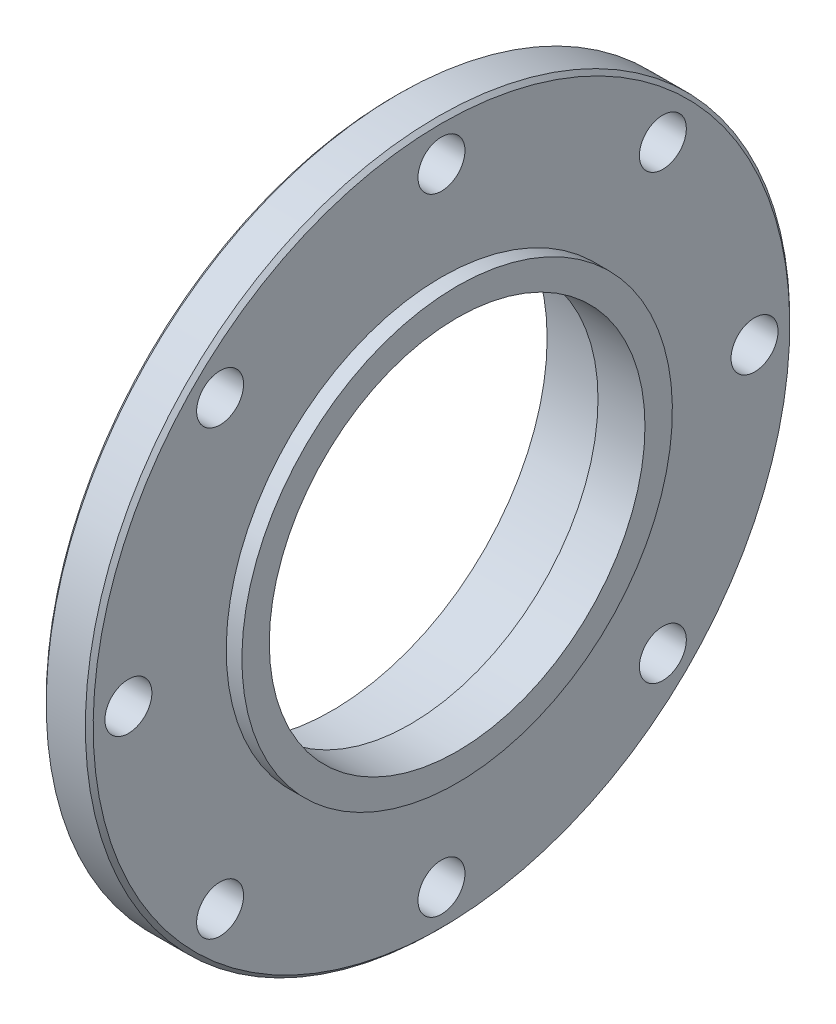
ISO-10303-21;
HEADER;
FILE_DESCRIPTION(('STEP AP214'),'2;1');
FILE_NAME('part.step','',(''),(''),'','','');
FILE_SCHEMA(('AUTOMOTIVE_DESIGN { 1 0 10303 214 1 1 1 1 }'));
ENDSEC;
DATA;
#1=APPLICATION_CONTEXT('core data for automotive mechanical design processes');
#2=APPLICATION_PROTOCOL_DEFINITION('international standard','automotive_design',2000,#1);
#3=PRODUCT_CONTEXT('',#1,'mechanical');
#4=PRODUCT('Part','Part','',(#3));
#5=PRODUCT_RELATED_PRODUCT_CATEGORY('part','',(#4));
#6=PRODUCT_DEFINITION_FORMATION('','',#4);
#7=PRODUCT_DEFINITION_CONTEXT('part definition',#1,'design');
#8=PRODUCT_DEFINITION('design','',#6,#7);
#9=PRODUCT_DEFINITION_SHAPE('','',#8);
#10=(LENGTH_UNIT() NAMED_UNIT(*) SI_UNIT(.MILLI.,.METRE.));
#11=(NAMED_UNIT(*) PLANE_ANGLE_UNIT() SI_UNIT($,.RADIAN.));
#12=(NAMED_UNIT(*) SI_UNIT($,.STERADIAN.) SOLID_ANGLE_UNIT());
#13=UNCERTAINTY_MEASURE_WITH_UNIT(LENGTH_MEASURE(1.E-05),#10,'distance_accuracy_value','');
#14=(GEOMETRIC_REPRESENTATION_CONTEXT(3) GLOBAL_UNCERTAINTY_ASSIGNED_CONTEXT((#13)) GLOBAL_UNIT_ASSIGNED_CONTEXT((#10,
#11,#12)) REPRESENTATION_CONTEXT('',''));
#15=CARTESIAN_POINT('',(0.,0.,0.));
#16=DIRECTION('',(0.,0.,1.));
#17=DIRECTION('',(1.,0.,0.));
#18=AXIS2_PLACEMENT_3D('',#15,#16,#17);
#19=CARTESIAN_POINT('',(0.,0.,0.));
#20=DIRECTION('',(-1.,0.,0.));
#21=DIRECTION('',(0.,-1.,0.));
#22=AXIS2_PLACEMENT_3D('',#19,#20,#21);
#23=PLANE('',#22);
#24=CARTESIAN_POINT('',(0.,0.,0.));
#25=DIRECTION('',(-1.,0.,0.));
#26=DIRECTION('',(0.,-1.,0.));
#27=AXIS2_PLACEMENT_3D('',#24,#25,#26);
#28=CIRCLE('',#27,29.5);
#29=CARTESIAN_POINT('',(0.,-29.5,0.));
#30=VERTEX_POINT('',#29);
#31=EDGE_CURVE('E68',#30,#30,#28,.T.);
#32=ORIENTED_EDGE('',*,*,#31,.T.);
#33=EDGE_LOOP('',(#32));
#34=FACE_BOUND('',#33,.T.);
#35=CARTESIAN_POINT('',(0.,0.,0.));
#36=DIRECTION('',(1.,0.,0.));
#37=DIRECTION('',(0.,0.,-1.));
#38=AXIS2_PLACEMENT_3D('',#35,#36,#37);
#39=CIRCLE('',#38,27.5);
#40=CARTESIAN_POINT('',(0.,0.,-27.5));
#41=VERTEX_POINT('',#40);
#42=EDGE_CURVE('E106',#41,#41,#39,.T.);
#43=ORIENTED_EDGE('',*,*,#42,.T.);
#44=EDGE_LOOP('',(#43));
#45=FACE_BOUND('',#44,.T.);
#46=ADVANCED_FACE('F42',(#34,#45),#23,.T.);
#47=CARTESIAN_POINT('',(16.,0.,0.));
#48=DIRECTION('',(1.,0.,0.));
#49=DIRECTION('',(0.,1.,0.));
#50=AXIS2_PLACEMENT_3D('',#47,#48,#49);
#51=CYLINDRICAL_SURFACE('',#50,30.);
#52=CARTESIAN_POINT('',(3.,0.,0.));
#53=DIRECTION('',(-1.,0.,0.));
#54=DIRECTION('',(0.,-1.,0.));
#55=AXIS2_PLACEMENT_3D('',#52,#53,#54);
#56=CIRCLE('',#55,30.);
#57=CARTESIAN_POINT('',(2.99999999999999,-30.,0.));
#58=VERTEX_POINT('',#57);
#59=EDGE_CURVE('E10',#58,#58,#56,.T.);
#60=ORIENTED_EDGE('',*,*,#59,.T.);
#61=EDGE_LOOP('',(#60));
#62=FACE_BOUND('',#61,.T.);
#63=CARTESIAN_POINT('',(0.499999999999957,0.,0.));
#64=DIRECTION('',(-1.,0.,0.));
#65=DIRECTION('',(0.,-1.,0.));
#66=AXIS2_PLACEMENT_3D('',#63,#64,#65);
#67=CIRCLE('',#66,30.);
#68=CARTESIAN_POINT('',(0.499999999999954,-30.,0.));
#69=VERTEX_POINT('',#68);
#70=EDGE_CURVE('E71',#69,#69,#67,.F.);
#71=ORIENTED_EDGE('',*,*,#70,.T.);
#72=EDGE_LOOP('',(#71));
#73=FACE_BOUND('',#72,.T.);
#74=ADVANCED_FACE('F147',(#62,#73),#51,.T.);
#75=CARTESIAN_POINT('',(8.,30.,0.));
#76=DIRECTION('',(-1.,0.,0.));
#77=DIRECTION('',(0.,-1.,0.));
#78=AXIS2_PLACEMENT_3D('',#75,#76,#77);
#79=PLANE('',#78);
#80=CARTESIAN_POINT('',(8.,0.,0.));
#81=DIRECTION('',(-1.,0.,0.));
#82=DIRECTION('',(0.,-1.,0.));
#83=AXIS2_PLACEMENT_3D('',#80,#81,#82);
#84=CIRCLE('',#83,35.);
#85=CARTESIAN_POINT('',(7.99999999999999,-35.,0.));
#86=VERTEX_POINT('',#85);
#87=EDGE_CURVE('E49',#86,#86,#84,.F.);
#88=ORIENTED_EDGE('',*,*,#87,.T.);
#89=EDGE_LOOP('',(#88));
#90=FACE_BOUND('',#89,.T.);
#91=CARTESIAN_POINT('',(8.,0.,0.));
#92=DIRECTION('',(-1.,0.,0.));
#93=DIRECTION('',(0.,-1.,0.));
#94=AXIS2_PLACEMENT_3D('',#91,#92,#93);
#95=CIRCLE('',#94,44.5);
#96=CARTESIAN_POINT('',(7.99999999999999,-44.5,0.));
#97=VERTEX_POINT('',#96);
#98=EDGE_CURVE('E57',#97,#97,#95,.T.);
#99=ORIENTED_EDGE('',*,*,#98,.T.);
#100=EDGE_LOOP('',(#99));
#101=FACE_BOUND('',#100,.T.);
#102=CARTESIAN_POINT('',(8.,40.,0.));
#103=DIRECTION('',(-1.,0.,0.));
#104=DIRECTION('',(0.,-1.,0.));
#105=AXIS2_PLACEMENT_3D('',#102,#103,#104);
#106=CIRCLE('',#105,3.);
#107=CARTESIAN_POINT('',(8.,37.,0.));
#108=VERTEX_POINT('',#107);
#109=EDGE_CURVE('E100',#108,#108,#106,.T.);
#110=ORIENTED_EDGE('',*,*,#109,.F.);
#111=EDGE_LOOP('',(#110));
#112=FACE_BOUND('',#111,.T.);
#113=CARTESIAN_POINT('',(8.,28.2842712474619,28.2842712474619));
#114=DIRECTION('',(-1.,0.,0.));
#115=DIRECTION('',(0.,-1.,0.));
#116=AXIS2_PLACEMENT_3D('',#113,#114,#115);
#117=CIRCLE('',#116,3.00000000000007);
#118=CARTESIAN_POINT('',(8.,25.2842712474618,28.2842712474619));
#119=VERTEX_POINT('',#118);
#120=EDGE_CURVE('E135',#119,#119,#117,.T.);
#121=ORIENTED_EDGE('',*,*,#120,.F.);
#122=EDGE_LOOP('',(#121));
#123=FACE_BOUND('',#122,.T.);
#124=CARTESIAN_POINT('',(8.,0.,40.));
#125=DIRECTION('',(-1.,0.,0.));
#126=DIRECTION('',(0.,-1.,0.));
#127=AXIS2_PLACEMENT_3D('',#124,#125,#126);
#128=CIRCLE('',#127,3.00000000000014);
#129=CARTESIAN_POINT('',(8.,-3.00000000000014,40.));
#130=VERTEX_POINT('',#129);
#131=EDGE_CURVE('E132',#130,#130,#128,.T.);
#132=ORIENTED_EDGE('',*,*,#131,.F.);
#133=EDGE_LOOP('',(#132));
#134=FACE_BOUND('',#133,.T.);
#135=CARTESIAN_POINT('',(7.99999999999999,-28.2842712474619,28.2842712474619));
#136=DIRECTION('',(-1.,0.,0.));
#137=DIRECTION('',(0.,-1.,0.));
#138=AXIS2_PLACEMENT_3D('',#135,#136,#137);
#139=CIRCLE('',#138,3.0000000000002);
#140=CARTESIAN_POINT('',(7.99999999999999,-31.2842712474621,28.2842712474619));
#141=VERTEX_POINT('',#140);
#142=EDGE_CURVE('E129',#141,#141,#139,.T.);
#143=ORIENTED_EDGE('',*,*,#142,.F.);
#144=EDGE_LOOP('',(#143));
#145=FACE_BOUND('',#144,.T.);
#146=CARTESIAN_POINT('',(7.99999999999999,-40.,0.));
#147=DIRECTION('',(-1.,0.,0.));
#148=DIRECTION('',(0.,-1.,0.));
#149=AXIS2_PLACEMENT_3D('',#146,#147,#148);
#150=CIRCLE('',#149,3.00000000000027);
#151=CARTESIAN_POINT('',(7.99999999999999,-43.0000000000003,0.));
#152=VERTEX_POINT('',#151);
#153=EDGE_CURVE('E126',#152,#152,#150,.T.);
#154=ORIENTED_EDGE('',*,*,#153,.F.);
#155=EDGE_LOOP('',(#154));
#156=FACE_BOUND('',#155,.T.);
#157=CARTESIAN_POINT('',(7.99999999999999,-28.2842712474619,-28.2842712474619));
#158=DIRECTION('',(-1.,0.,0.));
#159=DIRECTION('',(0.,-1.,0.));
#160=AXIS2_PLACEMENT_3D('',#157,#158,#159);
#161=CIRCLE('',#160,3.00000000000034);
#162=CARTESIAN_POINT('',(7.99999999999999,-31.2842712474622,-28.2842712474619));
#163=VERTEX_POINT('',#162);
#164=EDGE_CURVE('E123',#163,#163,#161,.T.);
#165=ORIENTED_EDGE('',*,*,#164,.F.);
#166=EDGE_LOOP('',(#165));
#167=FACE_BOUND('',#166,.T.);
#168=CARTESIAN_POINT('',(8.,0.,-40.));
#169=DIRECTION('',(-1.,0.,0.));
#170=DIRECTION('',(0.,-1.,0.));
#171=AXIS2_PLACEMENT_3D('',#168,#169,#170);
#172=CIRCLE('',#171,3.00000000000041);
#173=CARTESIAN_POINT('',(8.,-3.00000000000042,-40.));
#174=VERTEX_POINT('',#173);
#175=EDGE_CURVE('E120',#174,#174,#172,.T.);
#176=ORIENTED_EDGE('',*,*,#175,.F.);
#177=EDGE_LOOP('',(#176));
#178=FACE_BOUND('',#177,.T.);
#179=CARTESIAN_POINT('',(8.,28.2842712474619,-28.2842712474619));
#180=DIRECTION('',(-1.,0.,0.));
#181=DIRECTION('',(0.,-1.,0.));
#182=AXIS2_PLACEMENT_3D('',#179,#180,#181);
#183=CIRCLE('',#182,3.00000000000048);
#184=CARTESIAN_POINT('',(8.,25.2842712474614,-28.2842712474619));
#185=VERTEX_POINT('',#184);
#186=EDGE_CURVE('E117',#185,#185,#183,.T.);
#187=ORIENTED_EDGE('',*,*,#186,.F.);
#188=EDGE_LOOP('',(#187));
#189=FACE_BOUND('',#188,.T.);
#190=ADVANCED_FACE('F143',(#90,#101,#112,#123,#134,#145,#156,#167,#178,#189),#79,.T.);
#191=CARTESIAN_POINT('',(16.,0.,0.));
#192=DIRECTION('',(1.,0.,0.));
#193=DIRECTION('',(0.,1.,0.));
#194=AXIS2_PLACEMENT_3D('',#191,#192,#193);
#195=CYLINDRICAL_SURFACE('',#194,45.);
#196=CARTESIAN_POINT('',(8.5,0.,0.));
#197=DIRECTION('',(-1.,0.,0.));
#198=DIRECTION('',(0.,-1.,0.));
#199=AXIS2_PLACEMENT_3D('',#196,#197,#198);
#200=CIRCLE('',#199,45.);
#201=CARTESIAN_POINT('',(8.5,-45.,0.));
#202=VERTEX_POINT('',#201);
#203=EDGE_CURVE('E62',#202,#202,#200,.F.);
#204=ORIENTED_EDGE('',*,*,#203,.T.);
#205=EDGE_LOOP('',(#204));
#206=FACE_BOUND('',#205,.T.);
#207=CARTESIAN_POINT('',(13.5,0.,0.));
#208=DIRECTION('',(1.,0.,0.));
#209=DIRECTION('',(0.,1.,0.));
#210=AXIS2_PLACEMENT_3D('',#207,#208,#209);
#211=CIRCLE('',#210,45.);
#212=CARTESIAN_POINT('',(13.5,45.,0.));
#213=VERTEX_POINT('',#212);
#214=EDGE_CURVE('E65',#213,#213,#211,.F.);
#215=ORIENTED_EDGE('',*,*,#214,.T.);
#216=EDGE_LOOP('',(#215));
#217=FACE_BOUND('',#216,.T.);
#218=ADVANCED_FACE('F146',(#206,#217),#195,.T.);
#219=CARTESIAN_POINT('',(14.,45.,0.));
#220=DIRECTION('',(1.,0.,0.));
#221=DIRECTION('',(0.,1.,0.));
#222=AXIS2_PLACEMENT_3D('',#219,#220,#221);
#223=PLANE('',#222);
#224=CARTESIAN_POINT('',(14.,0.,0.));
#225=DIRECTION('',(1.,0.,0.));
#226=DIRECTION('',(0.,1.,0.));
#227=AXIS2_PLACEMENT_3D('',#224,#225,#226);
#228=CIRCLE('',#227,44.5);
#229=CARTESIAN_POINT('',(14.,44.5,0.));
#230=VERTEX_POINT('',#229);
#231=EDGE_CURVE('E53',#230,#230,#228,.T.);
#232=ORIENTED_EDGE('',*,*,#231,.T.);
#233=EDGE_LOOP('',(#232));
#234=FACE_BOUND('',#233,.T.);
#235=CARTESIAN_POINT('',(14.,40.,0.));
#236=DIRECTION('',(1.,0.,0.));
#237=DIRECTION('',(0.,1.,0.));
#238=AXIS2_PLACEMENT_3D('',#235,#236,#237);
#239=CIRCLE('',#238,3.);
#240=CARTESIAN_POINT('',(14.,43.,0.));
#241=VERTEX_POINT('',#240);
#242=EDGE_CURVE('E75',#241,#241,#239,.T.);
#243=ORIENTED_EDGE('',*,*,#242,.F.);
#244=EDGE_LOOP('',(#243));
#245=FACE_BOUND('',#244,.T.);
#246=CARTESIAN_POINT('',(14.,28.2842712474619,28.2842712474619));
#247=DIRECTION('',(1.,0.,0.));
#248=DIRECTION('',(0.,1.,0.));
#249=AXIS2_PLACEMENT_3D('',#246,#247,#248);
#250=CIRCLE('',#249,3.00000000000007);
#251=CARTESIAN_POINT('',(14.,31.284271247462,28.2842712474619));
#252=VERTEX_POINT('',#251);
#253=EDGE_CURVE('E79',#252,#252,#250,.T.);
#254=ORIENTED_EDGE('',*,*,#253,.F.);
#255=EDGE_LOOP('',(#254));
#256=FACE_BOUND('',#255,.T.);
#257=CARTESIAN_POINT('',(14.,0.,40.));
#258=DIRECTION('',(1.,0.,0.));
#259=DIRECTION('',(0.,1.,0.));
#260=AXIS2_PLACEMENT_3D('',#257,#258,#259);
#261=CIRCLE('',#260,3.00000000000014);
#262=CARTESIAN_POINT('',(14.,3.00000000000014,40.));
#263=VERTEX_POINT('',#262);
#264=EDGE_CURVE('E82',#263,#263,#261,.T.);
#265=ORIENTED_EDGE('',*,*,#264,.F.);
#266=EDGE_LOOP('',(#265));
#267=FACE_BOUND('',#266,.T.);
#268=CARTESIAN_POINT('',(14.,-28.2842712474619,28.2842712474619));
#269=DIRECTION('',(1.,0.,0.));
#270=DIRECTION('',(0.,1.,0.));
#271=AXIS2_PLACEMENT_3D('',#268,#269,#270);
#272=CIRCLE('',#271,3.0000000000002);
#273=CARTESIAN_POINT('',(14.,-25.2842712474617,28.2842712474619));
#274=VERTEX_POINT('',#273);
#275=EDGE_CURVE('E85',#274,#274,#272,.T.);
#276=ORIENTED_EDGE('',*,*,#275,.F.);
#277=EDGE_LOOP('',(#276));
#278=FACE_BOUND('',#277,.T.);
#279=CARTESIAN_POINT('',(14.,-40.,0.));
#280=DIRECTION('',(1.,0.,0.));
#281=DIRECTION('',(0.,1.,0.));
#282=AXIS2_PLACEMENT_3D('',#279,#280,#281);
#283=CIRCLE('',#282,3.00000000000027);
#284=CARTESIAN_POINT('',(14.,-36.9999999999997,0.));
#285=VERTEX_POINT('',#284);
#286=EDGE_CURVE('E88',#285,#285,#283,.T.);
#287=ORIENTED_EDGE('',*,*,#286,.F.);
#288=EDGE_LOOP('',(#287));
#289=FACE_BOUND('',#288,.T.);
#290=CARTESIAN_POINT('',(14.,-28.2842712474619,-28.2842712474619));
#291=DIRECTION('',(1.,0.,0.));
#292=DIRECTION('',(0.,1.,0.));
#293=AXIS2_PLACEMENT_3D('',#290,#291,#292);
#294=CIRCLE('',#293,3.00000000000034);
#295=CARTESIAN_POINT('',(14.,-25.2842712474616,-28.2842712474619));
#296=VERTEX_POINT('',#295);
#297=EDGE_CURVE('E91',#296,#296,#294,.T.);
#298=ORIENTED_EDGE('',*,*,#297,.F.);
#299=EDGE_LOOP('',(#298));
#300=FACE_BOUND('',#299,.T.);
#301=CARTESIAN_POINT('',(14.,0.,-40.));
#302=DIRECTION('',(1.,0.,0.));
#303=DIRECTION('',(0.,1.,0.));
#304=AXIS2_PLACEMENT_3D('',#301,#302,#303);
#305=CIRCLE('',#304,3.00000000000041);
#306=CARTESIAN_POINT('',(14.,3.0000000000004,-40.));
#307=VERTEX_POINT('',#306);
#308=EDGE_CURVE('E94',#307,#307,#305,.T.);
#309=ORIENTED_EDGE('',*,*,#308,.F.);
#310=EDGE_LOOP('',(#309));
#311=FACE_BOUND('',#310,.T.);
#312=CARTESIAN_POINT('',(14.,28.2842712474619,-28.2842712474619));
#313=DIRECTION('',(1.,0.,0.));
#314=DIRECTION('',(0.,1.,0.));
#315=AXIS2_PLACEMENT_3D('',#312,#313,#314);
#316=CIRCLE('',#315,3.00000000000048);
#317=CARTESIAN_POINT('',(14.,31.2842712474624,-28.2842712474619));
#318=VERTEX_POINT('',#317);
#319=EDGE_CURVE('E97',#318,#318,#316,.T.);
#320=ORIENTED_EDGE('',*,*,#319,.F.);
#321=EDGE_LOOP('',(#320));
#322=FACE_BOUND('',#321,.T.);
#323=CARTESIAN_POINT('',(14.,0.,0.));
#324=DIRECTION('',(1.,0.,0.));
#325=DIRECTION('',(0.,1.,0.));
#326=AXIS2_PLACEMENT_3D('',#323,#324,#325);
#327=CIRCLE('',#326,27.5);
#328=CARTESIAN_POINT('',(14.,27.5,0.));
#329=VERTEX_POINT('',#328);
#330=EDGE_CURVE('E74',#329,#329,#327,.T.);
#331=ORIENTED_EDGE('',*,*,#330,.F.);
#332=EDGE_LOOP('',(#331));
#333=FACE_BOUND('',#332,.T.);
#334=ADVANCED_FACE('F215',(#234,#245,#256,#267,#278,#289,#300,#311,#322,#333),#223,.T.);
#335=CARTESIAN_POINT('',(16.,0.,0.));
#336=DIRECTION('',(1.,0.,0.));
#337=DIRECTION('',(0.,1.,0.));
#338=AXIS2_PLACEMENT_3D('',#335,#336,#337);
#339=CYLINDRICAL_SURFACE('',#338,27.5);
#340=ORIENTED_EDGE('',*,*,#330,.T.);
#341=EDGE_LOOP('',(#340));
#342=FACE_BOUND('',#341,.T.);
#343=CARTESIAN_POINT('',(16.,0.,0.));
#344=DIRECTION('',(1.,0.,0.));
#345=DIRECTION('',(0.,1.,0.));
#346=AXIS2_PLACEMENT_3D('',#343,#344,#345);
#347=CIRCLE('',#346,27.5);
#348=CARTESIAN_POINT('',(16.,27.5,0.));
#349=VERTEX_POINT('',#348);
#350=EDGE_CURVE('E103',#349,#349,#347,.T.);
#351=ORIENTED_EDGE('',*,*,#350,.F.);
#352=EDGE_LOOP('',(#351));
#353=FACE_BOUND('',#352,.T.);
#354=ADVANCED_FACE('F218',(#342,#353),#339,.T.);
#355=CARTESIAN_POINT('',(16.,27.5,0.));
#356=DIRECTION('',(1.,0.,0.));
#357=DIRECTION('',(0.,1.,0.));
#358=AXIS2_PLACEMENT_3D('',#355,#356,#357);
#359=PLANE('',#358);
#360=CARTESIAN_POINT('',(16.,0.,0.));
#361=DIRECTION('',(1.,0.,0.));
#362=DIRECTION('',(0.,0.,-1.));
#363=AXIS2_PLACEMENT_3D('',#360,#361,#362);
#364=CIRCLE('',#363,24.);
#365=CARTESIAN_POINT('',(16.,0.,-24.));
#366=VERTEX_POINT('',#365);
#367=EDGE_CURVE('E78',#366,#366,#364,.T.);
#368=ORIENTED_EDGE('',*,*,#367,.F.);
#369=EDGE_LOOP('',(#368));
#370=FACE_BOUND('',#369,.T.);
#371=ORIENTED_EDGE('',*,*,#350,.T.);
#372=EDGE_LOOP('',(#371));
#373=FACE_BOUND('',#372,.T.);
#374=ADVANCED_FACE('F240',(#370,#373),#359,.T.);
#375=CARTESIAN_POINT('',(16.,0.,0.));
#376=DIRECTION('',(1.,0.,0.));
#377=DIRECTION('',(0.,0.,-1.));
#378=AXIS2_PLACEMENT_3D('',#375,#376,#377);
#379=CYLINDRICAL_SURFACE('',#378,27.5);
#380=ORIENTED_EDGE('',*,*,#42,.F.);
#381=EDGE_LOOP('',(#380));
#382=FACE_BOUND('',#381,.T.);
#383=CARTESIAN_POINT('',(10.,0.,0.));
#384=DIRECTION('',(1.,0.,0.));
#385=DIRECTION('',(0.,0.,-1.));
#386=AXIS2_PLACEMENT_3D('',#383,#384,#385);
#387=CIRCLE('',#386,27.5);
#388=CARTESIAN_POINT('',(10.,0.,-27.5));
#389=VERTEX_POINT('',#388);
#390=EDGE_CURVE('E109',#389,#389,#387,.T.);
#391=ORIENTED_EDGE('',*,*,#390,.T.);
#392=EDGE_LOOP('',(#391));
#393=FACE_BOUND('',#392,.T.);
#394=ADVANCED_FACE('F245',(#382,#393),#379,.F.);
#395=CARTESIAN_POINT('',(10.,27.5,0.));
#396=DIRECTION('',(1.,0.,0.));
#397=DIRECTION('',(0.,0.,-1.));
#398=AXIS2_PLACEMENT_3D('',#395,#396,#397);
#399=PLANE('',#398);
#400=ORIENTED_EDGE('',*,*,#390,.F.);
#401=EDGE_LOOP('',(#400));
#402=FACE_BOUND('',#401,.T.);
#403=CARTESIAN_POINT('',(10.,0.,0.));
#404=DIRECTION('',(1.,0.,0.));
#405=DIRECTION('',(0.,0.,-1.));
#406=AXIS2_PLACEMENT_3D('',#403,#404,#405);
#407=CIRCLE('',#406,24.);
#408=CARTESIAN_POINT('',(10.,0.,-24.));
#409=VERTEX_POINT('',#408);
#410=EDGE_CURVE('E112',#409,#409,#407,.T.);
#411=ORIENTED_EDGE('',*,*,#410,.T.);
#412=EDGE_LOOP('',(#411));
#413=FACE_BOUND('',#412,.T.);
#414=ADVANCED_FACE('F176',(#402,#413),#399,.F.);
#415=CARTESIAN_POINT('',(16.,0.,0.));
#416=DIRECTION('',(1.,0.,0.));
#417=DIRECTION('',(0.,0.,-1.));
#418=AXIS2_PLACEMENT_3D('',#415,#416,#417);
#419=CYLINDRICAL_SURFACE('',#418,24.);
#420=ORIENTED_EDGE('',*,*,#410,.F.);
#421=EDGE_LOOP('',(#420));
#422=FACE_BOUND('',#421,.T.);
#423=ORIENTED_EDGE('',*,*,#367,.T.);
#424=EDGE_LOOP('',(#423));
#425=FACE_BOUND('',#424,.T.);
#426=ADVANCED_FACE('F166',(#422,#425),#419,.F.);
#427=CARTESIAN_POINT('',(18.,28.2842712474619,-28.2842712474619));
#428=DIRECTION('',(-1.,0.,0.));
#429=DIRECTION('',(0.,-1.,0.));
#430=AXIS2_PLACEMENT_3D('',#427,#428,#429);
#431=CYLINDRICAL_SURFACE('',#430,3.00000000000048);
#432=ORIENTED_EDGE('',*,*,#319,.T.);
#433=EDGE_LOOP('',(#432));
#434=FACE_BOUND('',#433,.T.);
#435=ORIENTED_EDGE('',*,*,#186,.T.);
#436=EDGE_LOOP('',(#435));
#437=FACE_BOUND('',#436,.T.);
#438=ADVANCED_FACE('F163',(#434,#437),#431,.F.);
#439=CARTESIAN_POINT('',(18.,0.,-40.));
#440=DIRECTION('',(-1.,0.,0.));
#441=DIRECTION('',(0.,-1.,0.));
#442=AXIS2_PLACEMENT_3D('',#439,#440,#441);
#443=CYLINDRICAL_SURFACE('',#442,3.00000000000041);
#444=ORIENTED_EDGE('',*,*,#308,.T.);
#445=EDGE_LOOP('',(#444));
#446=FACE_BOUND('',#445,.T.);
#447=ORIENTED_EDGE('',*,*,#175,.T.);
#448=EDGE_LOOP('',(#447));
#449=FACE_BOUND('',#448,.T.);
#450=ADVANCED_FACE('F165',(#446,#449),#443,.F.);
#451=CARTESIAN_POINT('',(18.,-28.2842712474619,-28.2842712474619));
#452=DIRECTION('',(-1.,0.,0.));
#453=DIRECTION('',(0.,-1.,0.));
#454=AXIS2_PLACEMENT_3D('',#451,#452,#453);
#455=CYLINDRICAL_SURFACE('',#454,3.00000000000034);
#456=ORIENTED_EDGE('',*,*,#297,.T.);
#457=EDGE_LOOP('',(#456));
#458=FACE_BOUND('',#457,.T.);
#459=ORIENTED_EDGE('',*,*,#164,.T.);
#460=EDGE_LOOP('',(#459));
#461=FACE_BOUND('',#460,.T.);
#462=ADVANCED_FACE('F173',(#458,#461),#455,.F.);
#463=CARTESIAN_POINT('',(18.,-40.,0.));
#464=DIRECTION('',(-1.,0.,0.));
#465=DIRECTION('',(0.,-1.,0.));
#466=AXIS2_PLACEMENT_3D('',#463,#464,#465);
#467=CYLINDRICAL_SURFACE('',#466,3.00000000000027);
#468=ORIENTED_EDGE('',*,*,#286,.T.);
#469=EDGE_LOOP('',(#468));
#470=FACE_BOUND('',#469,.T.);
#471=ORIENTED_EDGE('',*,*,#153,.T.);
#472=EDGE_LOOP('',(#471));
#473=FACE_BOUND('',#472,.T.);
#474=ADVANCED_FACE('F320',(#470,#473),#467,.F.);
#475=CARTESIAN_POINT('',(18.,-28.2842712474619,28.2842712474619));
#476=DIRECTION('',(-1.,0.,0.));
#477=DIRECTION('',(0.,-1.,0.));
#478=AXIS2_PLACEMENT_3D('',#475,#476,#477);
#479=CYLINDRICAL_SURFACE('',#478,3.0000000000002);
#480=ORIENTED_EDGE('',*,*,#275,.T.);
#481=EDGE_LOOP('',(#480));
#482=FACE_BOUND('',#481,.T.);
#483=ORIENTED_EDGE('',*,*,#142,.T.);
#484=EDGE_LOOP('',(#483));
#485=FACE_BOUND('',#484,.T.);
#486=ADVANCED_FACE('F330',(#482,#485),#479,.F.);
#487=CARTESIAN_POINT('',(18.,0.,40.));
#488=DIRECTION('',(-1.,0.,0.));
#489=DIRECTION('',(0.,-1.,0.));
#490=AXIS2_PLACEMENT_3D('',#487,#488,#489);
#491=CYLINDRICAL_SURFACE('',#490,3.00000000000014);
#492=ORIENTED_EDGE('',*,*,#264,.T.);
#493=EDGE_LOOP('',(#492));
#494=FACE_BOUND('',#493,.T.);
#495=ORIENTED_EDGE('',*,*,#131,.T.);
#496=EDGE_LOOP('',(#495));
#497=FACE_BOUND('',#496,.T.);
#498=ADVANCED_FACE('F340',(#494,#497),#491,.F.);
#499=CARTESIAN_POINT('',(18.,28.2842712474619,28.2842712474619));
#500=DIRECTION('',(-1.,0.,0.));
#501=DIRECTION('',(0.,-1.,0.));
#502=AXIS2_PLACEMENT_3D('',#499,#500,#501);
#503=CYLINDRICAL_SURFACE('',#502,3.00000000000007);
#504=ORIENTED_EDGE('',*,*,#253,.T.);
#505=EDGE_LOOP('',(#504));
#506=FACE_BOUND('',#505,.T.);
#507=ORIENTED_EDGE('',*,*,#120,.T.);
#508=EDGE_LOOP('',(#507));
#509=FACE_BOUND('',#508,.T.);
#510=ADVANCED_FACE('F350',(#506,#509),#503,.F.);
#511=CARTESIAN_POINT('',(18.,40.,0.));
#512=DIRECTION('',(-1.,0.,0.));
#513=DIRECTION('',(0.,-1.,0.));
#514=AXIS2_PLACEMENT_3D('',#511,#512,#513);
#515=CYLINDRICAL_SURFACE('',#514,3.);
#516=ORIENTED_EDGE('',*,*,#242,.T.);
#517=EDGE_LOOP('',(#516));
#518=FACE_BOUND('',#517,.T.);
#519=ORIENTED_EDGE('',*,*,#109,.T.);
#520=EDGE_LOOP('',(#519));
#521=FACE_BOUND('',#520,.T.);
#522=ADVANCED_FACE('F141',(#518,#521),#515,.F.);
#523=CARTESIAN_POINT('',(0.499999999999957,0.,0.));
#524=DIRECTION('',(1.,0.,0.));
#525=DIRECTION('',(0.,1.,0.));
#526=AXIS2_PLACEMENT_3D('',#523,#524,#525);
#527=CONICAL_SURFACE('',#526,30.,0.785398163397447);
#528=ORIENTED_EDGE('',*,*,#31,.F.);
#529=EDGE_LOOP('',(#528));
#530=FACE_BOUND('',#529,.T.);
#531=ORIENTED_EDGE('',*,*,#70,.F.);
#532=EDGE_LOOP('',(#531));
#533=FACE_BOUND('',#532,.T.);
#534=ADVANCED_FACE('F189',(#530,#533),#527,.T.);
#535=CARTESIAN_POINT('',(8.5,0.,0.));
#536=DIRECTION('',(1.,0.,0.));
#537=DIRECTION('',(0.,1.,0.));
#538=AXIS2_PLACEMENT_3D('',#535,#536,#537);
#539=CONICAL_SURFACE('',#538,45.,0.785398163397448);
#540=ORIENTED_EDGE('',*,*,#98,.F.);
#541=EDGE_LOOP('',(#540));
#542=FACE_BOUND('',#541,.T.);
#543=ORIENTED_EDGE('',*,*,#203,.F.);
#544=EDGE_LOOP('',(#543));
#545=FACE_BOUND('',#544,.T.);
#546=ADVANCED_FACE('F195',(#542,#545),#539,.T.);
#547=CARTESIAN_POINT('',(14.,0.,0.));
#548=DIRECTION('',(-1.,0.,0.));
#549=DIRECTION('',(0.,-1.,0.));
#550=AXIS2_PLACEMENT_3D('',#547,#548,#549);
#551=CONICAL_SURFACE('',#550,44.5,0.785398163397428);
#552=ORIENTED_EDGE('',*,*,#214,.F.);
#553=EDGE_LOOP('',(#552));
#554=FACE_BOUND('',#553,.T.);
#555=ORIENTED_EDGE('',*,*,#231,.F.);
#556=EDGE_LOOP('',(#555));
#557=FACE_BOUND('',#556,.T.);
#558=ADVANCED_FACE('F201',(#554,#557),#551,.T.);
#559=CARTESIAN_POINT('',(3.,0.,0.));
#560=DIRECTION('',(-1.,0.,0.));
#561=DIRECTION('',(0.,-1.,0.));
#562=AXIS2_PLACEMENT_3D('',#559,#560,#561);
#563=TOROIDAL_SURFACE('',#562,35.,5.);
#564=ORIENTED_EDGE('',*,*,#59,.F.);
#565=EDGE_LOOP('',(#564));
#566=FACE_BOUND('',#565,.T.);
#567=ORIENTED_EDGE('',*,*,#87,.F.);
#568=EDGE_LOOP('',(#567));
#569=FACE_BOUND('',#568,.T.);
#570=ADVANCED_FACE('F44',(#566,#569),#563,.F.);
#571=CLOSED_SHELL('',(#46,#74,#190,#218,#334,#354,#374,#394,#414,#426,#438,#450,#462,#474,#486,
#498,#510,#522,#534,#546,#558,#570));
#572=MANIFOLD_SOLID_BREP('B2',#571);
#573=ADVANCED_BREP_SHAPE_REPRESENTATION('',(#18,#572),#14);
#574=SHAPE_DEFINITION_REPRESENTATION(#9,#573);
ENDSEC;
END-ISO-10303-21;
